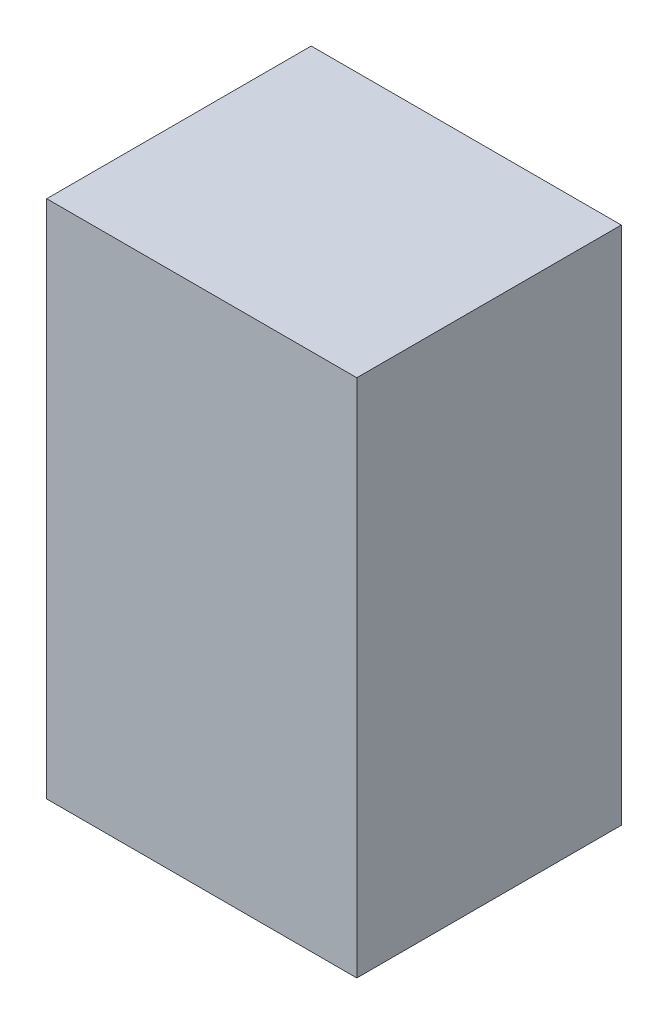
ISO-10303-21;
HEADER;
FILE_DESCRIPTION(('STEP AP214'),'2;1');
FILE_NAME('part.step','',(''),(''),'','','');
FILE_SCHEMA(('AUTOMOTIVE_DESIGN { 1 0 10303 214 1 1 1 1 }'));
ENDSEC;
DATA;
#1=APPLICATION_CONTEXT('core data for automotive mechanical design processes');
#2=APPLICATION_PROTOCOL_DEFINITION('international standard','automotive_design',2000,#1);
#3=PRODUCT_CONTEXT('',#1,'mechanical');
#4=PRODUCT('Part','Part','',(#3));
#5=PRODUCT_RELATED_PRODUCT_CATEGORY('part','',(#4));
#6=PRODUCT_DEFINITION_FORMATION('','',#4);
#7=PRODUCT_DEFINITION_CONTEXT('part definition',#1,'design');
#8=PRODUCT_DEFINITION('design','',#6,#7);
#9=PRODUCT_DEFINITION_SHAPE('','',#8);
#10=(LENGTH_UNIT() NAMED_UNIT(*) SI_UNIT(.MILLI.,.METRE.));
#11=(NAMED_UNIT(*) PLANE_ANGLE_UNIT() SI_UNIT($,.RADIAN.));
#12=(NAMED_UNIT(*) SI_UNIT($,.STERADIAN.) SOLID_ANGLE_UNIT());
#13=UNCERTAINTY_MEASURE_WITH_UNIT(LENGTH_MEASURE(1.E-05),#10,'distance_accuracy_value','');
#14=(GEOMETRIC_REPRESENTATION_CONTEXT(3) GLOBAL_UNCERTAINTY_ASSIGNED_CONTEXT((#13)) GLOBAL_UNIT_ASSIGNED_CONTEXT((#10,
#11,#12)) REPRESENTATION_CONTEXT('',''));
#15=CARTESIAN_POINT('',(0.,0.,0.));
#16=DIRECTION('',(0.,0.,1.));
#17=DIRECTION('',(1.,0.,0.));
#18=AXIS2_PLACEMENT_3D('',#15,#16,#17);
#19=CARTESIAN_POINT('',(-0.85000084,-1.42499842,1.44999964));
#20=DIRECTION('',(0.,0.,-1.));
#21=DIRECTION('',(-1.,0.,0.));
#22=AXIS2_PLACEMENT_3D('',#19,#20,#21);
#23=PLANE('',#22);
#24=DIRECTION('',(0.,1.,0.));
#25=VECTOR('',#24,1.);
#26=CARTESIAN_POINT('',(0.85000084,-1.42499842,1.44999964));
#27=LINE('',#26,#25);
#28=CARTESIAN_POINT('',(0.85000084,-1.42499842,1.44999964));
#29=VERTEX_POINT('',#28);
#30=CARTESIAN_POINT('',(0.85000084,1.42500096,1.44999964));
#31=VERTEX_POINT('',#30);
#32=EDGE_CURVE('E55',#29,#31,#27,.T.);
#33=ORIENTED_EDGE('',*,*,#32,.T.);
#34=DIRECTION('',(1.,0.,0.));
#35=VECTOR('',#34,1.);
#36=CARTESIAN_POINT('',(0.85000084,1.42500096,1.44999964));
#37=LINE('',#36,#35);
#38=CARTESIAN_POINT('',(-0.85000084,1.42500096,1.44999964));
#39=VERTEX_POINT('',#38);
#40=EDGE_CURVE('E58',#31,#39,#37,.F.);
#41=ORIENTED_EDGE('',*,*,#40,.T.);
#42=DIRECTION('',(0.,1.,0.));
#43=VECTOR('',#42,1.);
#44=CARTESIAN_POINT('',(-0.85000084,1.42500096,1.44999964));
#45=LINE('',#44,#43);
#46=CARTESIAN_POINT('',(-0.85000084,-1.42499842,1.44999964));
#47=VERTEX_POINT('',#46);
#48=EDGE_CURVE('E60',#39,#47,#45,.F.);
#49=ORIENTED_EDGE('',*,*,#48,.T.);
#50=DIRECTION('',(-1.,0.,0.));
#51=VECTOR('',#50,1.);
#52=CARTESIAN_POINT('',(-0.85000084,-1.42499842,1.44999964));
#53=LINE('',#52,#51);
#54=EDGE_CURVE('E20',#29,#47,#53,.T.);
#55=ORIENTED_EDGE('',*,*,#54,.F.);
#56=EDGE_LOOP('',(#33,#41,#49,#55));
#57=FACE_BOUND('',#56,.T.);
#58=ADVANCED_FACE('F17',(#57),#23,.F.);
#59=CARTESIAN_POINT('',(-0.85000084,1.42500096,0.));
#60=DIRECTION('',(1.,0.,0.));
#61=DIRECTION('',(0.,0.,-1.));
#62=AXIS2_PLACEMENT_3D('',#59,#60,#61);
#63=PLANE('',#62);
#64=DIRECTION('',(0.,0.,1.));
#65=VECTOR('',#64,1.);
#66=CARTESIAN_POINT('',(-0.85000084,-1.42499842,0.));
#67=LINE('',#66,#65);
#68=CARTESIAN_POINT('',(-0.85000084,-1.42499842,0.));
#69=VERTEX_POINT('',#68);
#70=EDGE_CURVE('E71',#69,#47,#67,.T.);
#71=ORIENTED_EDGE('',*,*,#70,.T.);
#72=ORIENTED_EDGE('',*,*,#48,.F.);
#73=DIRECTION('',(0.,0.,-1.));
#74=VECTOR('',#73,1.);
#75=CARTESIAN_POINT('',(-0.85000084,1.42500096,0.));
#76=LINE('',#75,#74);
#77=CARTESIAN_POINT('',(-0.85000084,1.42500096,0.));
#78=VERTEX_POINT('',#77);
#79=EDGE_CURVE('E65',#39,#78,#76,.T.);
#80=ORIENTED_EDGE('',*,*,#79,.T.);
#81=DIRECTION('',(0.,1.,0.));
#82=VECTOR('',#81,1.);
#83=CARTESIAN_POINT('',(-0.85000084,-1.42499842,0.));
#84=LINE('',#83,#82);
#85=EDGE_CURVE('E83',#69,#78,#84,.T.);
#86=ORIENTED_EDGE('',*,*,#85,.F.);
#87=EDGE_LOOP('',(#71,#72,#80,#86));
#88=FACE_BOUND('',#87,.T.);
#89=ADVANCED_FACE('F68',(#88),#63,.F.);
#90=CARTESIAN_POINT('',(0.85000084,1.42500096,0.));
#91=DIRECTION('',(0.,-1.,0.));
#92=DIRECTION('',(0.,0.,-1.));
#93=AXIS2_PLACEMENT_3D('',#90,#91,#92);
#94=PLANE('',#93);
#95=ORIENTED_EDGE('',*,*,#79,.F.);
#96=ORIENTED_EDGE('',*,*,#40,.F.);
#97=DIRECTION('',(0.,0.,1.));
#98=VECTOR('',#97,1.);
#99=CARTESIAN_POINT('',(0.85000084,1.42500096,0.));
#100=LINE('',#99,#98);
#101=CARTESIAN_POINT('',(0.85000084,1.42500096,0.));
#102=VERTEX_POINT('',#101);
#103=EDGE_CURVE('E77',#31,#102,#100,.F.);
#104=ORIENTED_EDGE('',*,*,#103,.T.);
#105=DIRECTION('',(-1.,0.,0.));
#106=VECTOR('',#105,1.);
#107=CARTESIAN_POINT('',(-0.85000084,1.42500096,0.));
#108=LINE('',#107,#106);
#109=EDGE_CURVE('E74',#78,#102,#108,.F.);
#110=ORIENTED_EDGE('',*,*,#109,.F.);
#111=EDGE_LOOP('',(#95,#96,#104,#110));
#112=FACE_BOUND('',#111,.T.);
#113=ADVANCED_FACE('F72',(#112),#94,.F.);
#114=CARTESIAN_POINT('',(0.85000084,-1.42499842,0.));
#115=DIRECTION('',(-1.,0.,0.));
#116=DIRECTION('',(0.,0.,1.));
#117=AXIS2_PLACEMENT_3D('',#114,#115,#116);
#118=PLANE('',#117);
#119=ORIENTED_EDGE('',*,*,#103,.F.);
#120=ORIENTED_EDGE('',*,*,#32,.F.);
#121=DIRECTION('',(0.,0.,1.));
#122=VECTOR('',#121,1.);
#123=CARTESIAN_POINT('',(0.85000084,-1.42499842,0.));
#124=LINE('',#123,#122);
#125=CARTESIAN_POINT('',(0.85000084,-1.42499842,0.));
#126=VERTEX_POINT('',#125);
#127=EDGE_CURVE('E35',#29,#126,#124,.F.);
#128=ORIENTED_EDGE('',*,*,#127,.T.);
#129=DIRECTION('',(0.,1.,0.));
#130=VECTOR('',#129,1.);
#131=CARTESIAN_POINT('',(0.85000084,-1.42499842,0.));
#132=LINE('',#131,#130);
#133=EDGE_CURVE('E26',#102,#126,#132,.F.);
#134=ORIENTED_EDGE('',*,*,#133,.F.);
#135=EDGE_LOOP('',(#119,#120,#128,#134));
#136=FACE_BOUND('',#135,.T.);
#137=ADVANCED_FACE('F89',(#136),#118,.F.);
#138=CARTESIAN_POINT('',(-0.85000084,-1.42499842,0.));
#139=DIRECTION('',(0.,1.,0.));
#140=DIRECTION('',(0.,0.,1.));
#141=AXIS2_PLACEMENT_3D('',#138,#139,#140);
#142=PLANE('',#141);
#143=ORIENTED_EDGE('',*,*,#127,.F.);
#144=ORIENTED_EDGE('',*,*,#54,.T.);
#145=ORIENTED_EDGE('',*,*,#70,.F.);
#146=DIRECTION('',(-1.,0.,0.));
#147=VECTOR('',#146,1.);
#148=CARTESIAN_POINT('',(-0.85000084,-1.42499842,0.));
#149=LINE('',#148,#147);
#150=EDGE_CURVE('E11',#126,#69,#149,.T.);
#151=ORIENTED_EDGE('',*,*,#150,.F.);
#152=EDGE_LOOP('',(#143,#144,#145,#151));
#153=FACE_BOUND('',#152,.T.);
#154=ADVANCED_FACE('F91',(#153),#142,.F.);
#155=CARTESIAN_POINT('',(-0.85000084,-1.42499842,0.));
#156=DIRECTION('',(0.,0.,-1.));
#157=DIRECTION('',(-1.,0.,0.));
#158=AXIS2_PLACEMENT_3D('',#155,#156,#157);
#159=PLANE('',#158);
#160=ORIENTED_EDGE('',*,*,#133,.T.);
#161=ORIENTED_EDGE('',*,*,#150,.T.);
#162=ORIENTED_EDGE('',*,*,#85,.T.);
#163=ORIENTED_EDGE('',*,*,#109,.T.);
#164=EDGE_LOOP('',(#160,#161,#162,#163));
#165=FACE_BOUND('',#164,.T.);
#166=ADVANCED_FACE('F88',(#165),#159,.T.);
#167=CLOSED_SHELL('',(#58,#89,#113,#137,#154,#166));
#168=MANIFOLD_SOLID_BREP('B1',#167);
#169=ADVANCED_BREP_SHAPE_REPRESENTATION('',(#18,#168),#14);
#170=SHAPE_DEFINITION_REPRESENTATION(#9,#169);
ENDSEC;
END-ISO-10303-21;
